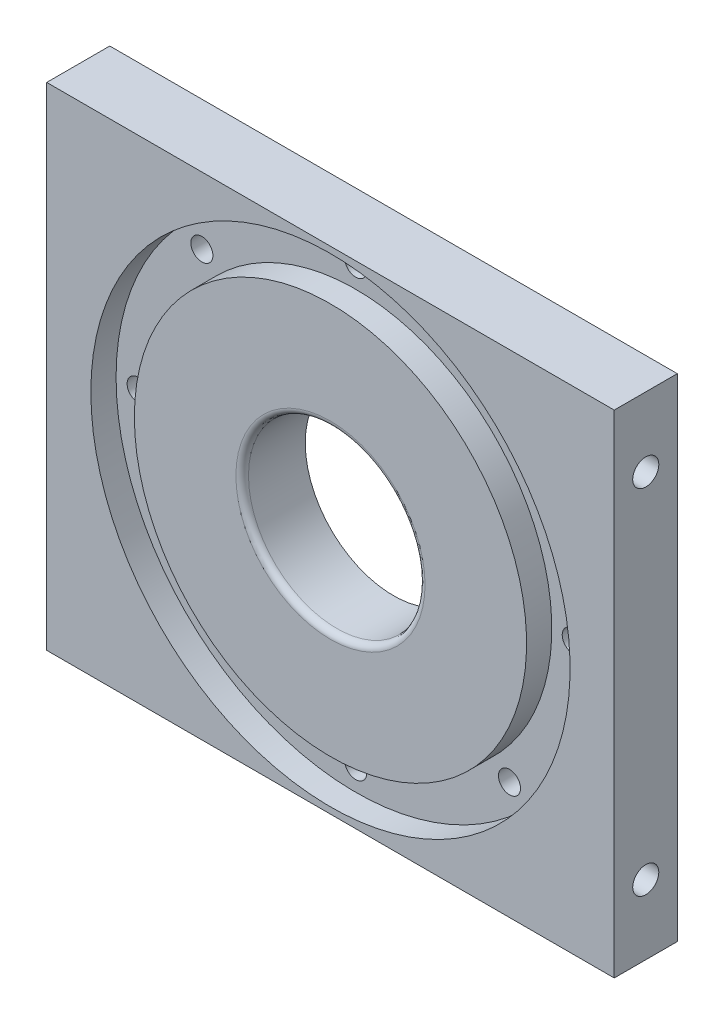
ISO-10303-21;
HEADER;
FILE_DESCRIPTION(('STEP AP214'),'2;1');
FILE_NAME('part.step','',(''),(''),'','','');
FILE_SCHEMA(('AUTOMOTIVE_DESIGN { 1 0 10303 214 1 1 1 1 }'));
ENDSEC;
DATA;
#1=APPLICATION_CONTEXT('core data for automotive mechanical design processes');
#2=APPLICATION_PROTOCOL_DEFINITION('international standard','automotive_design',2000,#1);
#3=PRODUCT_CONTEXT('',#1,'mechanical');
#4=PRODUCT('Part','Part','',(#3));
#5=PRODUCT_RELATED_PRODUCT_CATEGORY('part','',(#4));
#6=PRODUCT_DEFINITION_FORMATION('','',#4);
#7=PRODUCT_DEFINITION_CONTEXT('part definition',#1,'design');
#8=PRODUCT_DEFINITION('design','',#6,#7);
#9=PRODUCT_DEFINITION_SHAPE('','',#8);
#10=(LENGTH_UNIT() NAMED_UNIT(*) SI_UNIT(.MILLI.,.METRE.));
#11=(NAMED_UNIT(*) PLANE_ANGLE_UNIT() SI_UNIT($,.RADIAN.));
#12=(NAMED_UNIT(*) SI_UNIT($,.STERADIAN.) SOLID_ANGLE_UNIT());
#13=UNCERTAINTY_MEASURE_WITH_UNIT(LENGTH_MEASURE(1.E-05),#10,'distance_accuracy_value','');
#14=(GEOMETRIC_REPRESENTATION_CONTEXT(3) GLOBAL_UNCERTAINTY_ASSIGNED_CONTEXT((#13)) GLOBAL_UNIT_ASSIGNED_CONTEXT((#10,
#11,#12)) REPRESENTATION_CONTEXT('',''));
#15=CARTESIAN_POINT('',(0.,0.,0.));
#16=DIRECTION('',(0.,0.,1.));
#17=DIRECTION('',(1.,0.,0.));
#18=AXIS2_PLACEMENT_3D('',#15,#16,#17);
#19=CARTESIAN_POINT('',(0.,0.,6.));
#20=DIRECTION('',(0.,0.,-1.));
#21=DIRECTION('',(-1.,0.,0.));
#22=AXIS2_PLACEMENT_3D('',#19,#20,#21);
#23=PLANE('',#22);
#24=CARTESIAN_POINT('',(0.,0.,6.));
#25=DIRECTION('',(0.,0.,-1.));
#26=DIRECTION('',(-1.,0.,0.));
#27=AXIS2_PLACEMENT_3D('',#24,#25,#26);
#28=CIRCLE('',#27,31.1);
#29=CARTESIAN_POINT('',(-31.1,0.,6.));
#30=VERTEX_POINT('',#29);
#31=EDGE_CURVE('E20',#30,#30,#28,.F.);
#32=ORIENTED_EDGE('',*,*,#31,.F.);
#33=EDGE_LOOP('',(#32));
#34=FACE_BOUND('',#33,.T.);
#35=CARTESIAN_POINT('',(34.5,0.,5.99999999999999));
#36=DIRECTION('',(0.,0.,-1.));
#37=DIRECTION('',(-1.,0.,0.));
#38=AXIS2_PLACEMENT_3D('',#35,#36,#37);
#39=CIRCLE('',#38,1.75);
#40=CARTESIAN_POINT('',(32.75,0.,5.99999999999999));
#41=VERTEX_POINT('',#40);
#42=EDGE_CURVE('E93',#41,#41,#39,.T.);
#43=ORIENTED_EDGE('',*,*,#42,.T.);
#44=EDGE_LOOP('',(#43));
#45=FACE_BOUND('',#44,.T.);
#46=CARTESIAN_POINT('',(24.3951839509359,-24.3951839509359,5.99999999999999));
#47=DIRECTION('',(0.,0.,-1.));
#48=DIRECTION('',(-1.,0.,0.));
#49=AXIS2_PLACEMENT_3D('',#46,#47,#48);
#50=CIRCLE('',#49,1.75);
#51=CARTESIAN_POINT('',(22.6451839509359,-24.3951839509359,5.99999999999999));
#52=VERTEX_POINT('',#51);
#53=EDGE_CURVE('E328',#52,#52,#50,.T.);
#54=ORIENTED_EDGE('',*,*,#53,.T.);
#55=EDGE_LOOP('',(#54));
#56=FACE_BOUND('',#55,.T.);
#57=CARTESIAN_POINT('',(0.,-34.5,5.99999999999999));
#58=DIRECTION('',(0.,0.,-1.));
#59=DIRECTION('',(-1.,0.,0.));
#60=AXIS2_PLACEMENT_3D('',#57,#58,#59);
#61=CIRCLE('',#60,1.75);
#62=CARTESIAN_POINT('',(-1.75,-34.5,5.99999999999999));
#63=VERTEX_POINT('',#62);
#64=EDGE_CURVE('E331',#63,#63,#61,.T.);
#65=ORIENTED_EDGE('',*,*,#64,.T.);
#66=EDGE_LOOP('',(#65));
#67=FACE_BOUND('',#66,.T.);
#68=CARTESIAN_POINT('',(-24.3951839509359,-24.3951839509359,5.99999999999999));
#69=DIRECTION('',(0.,0.,-1.));
#70=DIRECTION('',(-1.,0.,0.));
#71=AXIS2_PLACEMENT_3D('',#68,#69,#70);
#72=CIRCLE('',#71,1.75);
#73=CARTESIAN_POINT('',(-26.1451839509359,-24.3951839509359,5.99999999999999));
#74=VERTEX_POINT('',#73);
#75=EDGE_CURVE('E334',#74,#74,#72,.T.);
#76=ORIENTED_EDGE('',*,*,#75,.T.);
#77=EDGE_LOOP('',(#76));
#78=FACE_BOUND('',#77,.T.);
#79=CARTESIAN_POINT('',(-34.5,0.,5.99999999999999));
#80=DIRECTION('',(0.,0.,-1.));
#81=DIRECTION('',(-1.,0.,0.));
#82=AXIS2_PLACEMENT_3D('',#79,#80,#81);
#83=CIRCLE('',#82,1.75);
#84=CARTESIAN_POINT('',(-36.25,0.,5.99999999999999));
#85=VERTEX_POINT('',#84);
#86=EDGE_CURVE('E337',#85,#85,#83,.T.);
#87=ORIENTED_EDGE('',*,*,#86,.T.);
#88=EDGE_LOOP('',(#87));
#89=FACE_BOUND('',#88,.T.);
#90=CARTESIAN_POINT('',(-24.3951839509359,24.3951839509359,5.99999999999999));
#91=DIRECTION('',(0.,0.,-1.));
#92=DIRECTION('',(-1.,0.,0.));
#93=AXIS2_PLACEMENT_3D('',#90,#91,#92);
#94=CIRCLE('',#93,1.75);
#95=CARTESIAN_POINT('',(-26.1451839509359,24.3951839509359,5.99999999999999));
#96=VERTEX_POINT('',#95);
#97=EDGE_CURVE('E340',#96,#96,#94,.T.);
#98=ORIENTED_EDGE('',*,*,#97,.T.);
#99=EDGE_LOOP('',(#98));
#100=FACE_BOUND('',#99,.T.);
#101=CARTESIAN_POINT('',(0.,34.5,5.99999999999999));
#102=DIRECTION('',(0.,0.,-1.));
#103=DIRECTION('',(-1.,0.,0.));
#104=AXIS2_PLACEMENT_3D('',#101,#102,#103);
#105=CIRCLE('',#104,1.75);
#106=CARTESIAN_POINT('',(-1.75000000000001,34.5,5.99999999999999));
#107=VERTEX_POINT('',#106);
#108=EDGE_CURVE('E343',#107,#107,#105,.T.);
#109=ORIENTED_EDGE('',*,*,#108,.T.);
#110=EDGE_LOOP('',(#109));
#111=FACE_BOUND('',#110,.T.);
#112=CARTESIAN_POINT('',(24.3951839509359,24.3951839509359,5.99999999999999));
#113=DIRECTION('',(0.,0.,-1.));
#114=DIRECTION('',(-1.,0.,0.));
#115=AXIS2_PLACEMENT_3D('',#112,#113,#114);
#116=CIRCLE('',#115,1.75);
#117=CARTESIAN_POINT('',(22.6451839509359,24.3951839509359,5.99999999999999));
#118=VERTEX_POINT('',#117);
#119=EDGE_CURVE('E346',#118,#118,#116,.T.);
#120=ORIENTED_EDGE('',*,*,#119,.T.);
#121=EDGE_LOOP('',(#120));
#122=FACE_BOUND('',#121,.T.);
#123=CARTESIAN_POINT('',(0.,0.,6.));
#124=DIRECTION('',(0.,0.,-1.));
#125=DIRECTION('',(-1.,0.,0.));
#126=AXIS2_PLACEMENT_3D('',#123,#124,#125);
#127=CIRCLE('',#126,38.);
#128=CARTESIAN_POINT('',(-38.,0.,6.));
#129=VERTEX_POINT('',#128);
#130=EDGE_CURVE('E349',#129,#129,#127,.F.);
#131=ORIENTED_EDGE('',*,*,#130,.T.);
#132=EDGE_LOOP('',(#131));
#133=FACE_BOUND('',#132,.T.);
#134=ADVANCED_FACE('F17',(#34,#45,#56,#67,#78,#89,#100,#111,#122,#133),#23,.F.);
#135=CARTESIAN_POINT('',(0.,0.,10.));
#136=DIRECTION('',(0.,0.,-1.));
#137=DIRECTION('',(-1.,0.,0.));
#138=AXIS2_PLACEMENT_3D('',#135,#136,#137);
#139=CYLINDRICAL_SURFACE('',#138,31.1);
#140=CARTESIAN_POINT('',(0.,0.,10.));
#141=DIRECTION('',(0.,0.,-1.));
#142=DIRECTION('',(-1.,0.,0.));
#143=AXIS2_PLACEMENT_3D('',#140,#141,#142);
#144=CIRCLE('',#143,31.1);
#145=CARTESIAN_POINT('',(-31.1,0.,10.));
#146=VERTEX_POINT('',#145);
#147=EDGE_CURVE('E86',#146,#146,#144,.F.);
#148=ORIENTED_EDGE('',*,*,#147,.F.);
#149=EDGE_LOOP('',(#148));
#150=FACE_BOUND('',#149,.T.);
#151=ORIENTED_EDGE('',*,*,#31,.T.);
#152=EDGE_LOOP('',(#151));
#153=FACE_BOUND('',#152,.T.);
#154=ADVANCED_FACE('F79',(#150,#153),#139,.T.);
#155=CARTESIAN_POINT('',(-30.0000000011664,-28.,5.));
#156=DIRECTION('',(-1.,0.,0.));
#157=DIRECTION('',(0.,0.,1.));
#158=AXIS2_PLACEMENT_3D('',#155,#156,#157);
#159=CONICAL_SURFACE('',#158,2.06699999909688,1.0297442573991);
#160=CARTESIAN_POINT('',(-28.7580210987812,-28.,4.99999999988177));
#161=VERTEX_POINT('',#160);
#162=VERTEX_LOOP('',#161);
#163=FACE_BOUND('',#162,.T.);
#164=CARTESIAN_POINT('',(-30.,-28.,5.));
#165=DIRECTION('',(-1.,0.,0.));
#166=DIRECTION('',(0.,-1.,0.));
#167=AXIS2_PLACEMENT_3D('',#164,#165,#166);
#168=CIRCLE('',#167,2.067);
#169=CARTESIAN_POINT('',(-30.,-30.067,5.));
#170=VERTEX_POINT('',#169);
#171=EDGE_CURVE('E83',#170,#170,#168,.T.);
#172=ORIENTED_EDGE('',*,*,#171,.T.);
#173=EDGE_LOOP('',(#172));
#174=FACE_BOUND('',#173,.T.);
#175=ADVANCED_FACE('F75',(#163,#174),#159,.F.);
#176=CARTESIAN_POINT('',(-30.0000000011664,28.,5.));
#177=DIRECTION('',(-1.,0.,0.));
#178=DIRECTION('',(0.,0.,1.));
#179=AXIS2_PLACEMENT_3D('',#176,#177,#178);
#180=CONICAL_SURFACE('',#179,2.06699999909688,1.0297442573991);
#181=CARTESIAN_POINT('',(-28.7580210987812,28.,4.99999999988177));
#182=VERTEX_POINT('',#181);
#183=VERTEX_LOOP('',#182);
#184=FACE_BOUND('',#183,.T.);
#185=CARTESIAN_POINT('',(-30.,28.,5.));
#186=DIRECTION('',(-1.,0.,0.));
#187=DIRECTION('',(0.,-1.,0.));
#188=AXIS2_PLACEMENT_3D('',#185,#186,#187);
#189=CIRCLE('',#188,2.067);
#190=CARTESIAN_POINT('',(-30.,25.933,5.));
#191=VERTEX_POINT('',#190);
#192=EDGE_CURVE('E85',#191,#191,#189,.T.);
#193=ORIENTED_EDGE('',*,*,#192,.T.);
#194=EDGE_LOOP('',(#193));
#195=FACE_BOUND('',#194,.T.);
#196=ADVANCED_FACE('F78',(#184,#195),#180,.F.);
#197=CARTESIAN_POINT('',(30.0000000011664,-28.,5.));
#198=DIRECTION('',(1.,0.,0.));
#199=DIRECTION('',(0.,0.,-1.));
#200=AXIS2_PLACEMENT_3D('',#197,#198,#199);
#201=CONICAL_SURFACE('',#200,2.06699999910597,1.02974425739085);
#202=CARTESIAN_POINT('',(28.7580210987812,-28.,5.00000000016598));
#203=VERTEX_POINT('',#202);
#204=VERTEX_LOOP('',#203);
#205=FACE_BOUND('',#204,.T.);
#206=CARTESIAN_POINT('',(30.,-28.,5.));
#207=DIRECTION('',(1.,0.,0.));
#208=DIRECTION('',(0.,0.,-1.));
#209=AXIS2_PLACEMENT_3D('',#206,#207,#208);
#210=CIRCLE('',#209,2.067);
#211=CARTESIAN_POINT('',(30.,-28.,2.933));
#212=VERTEX_POINT('',#211);
#213=EDGE_CURVE('E89',#212,#212,#210,.T.);
#214=ORIENTED_EDGE('',*,*,#213,.T.);
#215=EDGE_LOOP('',(#214));
#216=FACE_BOUND('',#215,.T.);
#217=ADVANCED_FACE('F161',(#205,#216),#201,.F.);
#218=CARTESIAN_POINT('',(30.0000000011664,28.,5.));
#219=DIRECTION('',(1.,0.,0.));
#220=DIRECTION('',(0.,0.,-1.));
#221=AXIS2_PLACEMENT_3D('',#218,#219,#220);
#222=CONICAL_SURFACE('',#221,2.06699999910597,1.02974425739085);
#223=CARTESIAN_POINT('',(28.7580210987812,28.,5.00000000016598));
#224=VERTEX_POINT('',#223);
#225=VERTEX_LOOP('',#224);
#226=FACE_BOUND('',#225,.T.);
#227=CARTESIAN_POINT('',(30.,28.,5.));
#228=DIRECTION('',(1.,0.,0.));
#229=DIRECTION('',(0.,0.,-1.));
#230=AXIS2_PLACEMENT_3D('',#227,#228,#229);
#231=CIRCLE('',#230,2.067);
#232=CARTESIAN_POINT('',(30.,28.,2.933));
#233=VERTEX_POINT('',#232);
#234=EDGE_CURVE('E249',#233,#233,#231,.T.);
#235=ORIENTED_EDGE('',*,*,#234,.T.);
#236=EDGE_LOOP('',(#235));
#237=FACE_BOUND('',#236,.T.);
#238=ADVANCED_FACE('F157',(#226,#237),#222,.F.);
#239=CARTESIAN_POINT('',(0.,0.,10.));
#240=DIRECTION('',(0.,0.,-1.));
#241=DIRECTION('',(-1.,0.,0.));
#242=AXIS2_PLACEMENT_3D('',#239,#240,#241);
#243=CYLINDRICAL_SURFACE('',#242,38.);
#244=CARTESIAN_POINT('',(0.,0.,10.));
#245=DIRECTION('',(0.,0.,-1.));
#246=DIRECTION('',(-1.,0.,0.));
#247=AXIS2_PLACEMENT_3D('',#244,#245,#246);
#248=CIRCLE('',#247,38.);
#249=CARTESIAN_POINT('',(-38.,0.,10.));
#250=VERTEX_POINT('',#249);
#251=EDGE_CURVE('E253',#250,#250,#248,.T.);
#252=ORIENTED_EDGE('',*,*,#251,.F.);
#253=EDGE_LOOP('',(#252));
#254=FACE_BOUND('',#253,.T.);
#255=ORIENTED_EDGE('',*,*,#130,.F.);
#256=EDGE_LOOP('',(#255));
#257=FACE_BOUND('',#256,.T.);
#258=ADVANCED_FACE('F153',(#254,#257),#243,.F.);
#259=CARTESIAN_POINT('',(24.3951839509359,24.3951839509359,119.515689346629));
#260=DIRECTION('',(0.,0.,-1.));
#261=DIRECTION('',(-1.,0.,0.));
#262=AXIS2_PLACEMENT_3D('',#259,#260,#261);
#263=CYLINDRICAL_SURFACE('',#262,1.75);
#264=CARTESIAN_POINT('',(24.3951839509359,24.3951839509359,3.));
#265=DIRECTION('',(0.,0.,-1.));
#266=DIRECTION('',(-1.,0.,0.));
#267=AXIS2_PLACEMENT_3D('',#264,#265,#266);
#268=CIRCLE('',#267,1.75);
#269=CARTESIAN_POINT('',(22.6451839509359,24.3951839509359,3.));
#270=VERTEX_POINT('',#269);
#271=EDGE_CURVE('E318',#270,#270,#268,.F.);
#272=ORIENTED_EDGE('',*,*,#271,.F.);
#273=EDGE_LOOP('',(#272));
#274=FACE_BOUND('',#273,.T.);
#275=ORIENTED_EDGE('',*,*,#119,.F.);
#276=EDGE_LOOP('',(#275));
#277=FACE_BOUND('',#276,.T.);
#278=ADVANCED_FACE('F149',(#274,#277),#263,.F.);
#279=CARTESIAN_POINT('',(0.,34.5,119.515689346629));
#280=DIRECTION('',(0.,0.,-1.));
#281=DIRECTION('',(-1.,0.,0.));
#282=AXIS2_PLACEMENT_3D('',#279,#280,#281);
#283=CYLINDRICAL_SURFACE('',#282,1.75);
#284=CARTESIAN_POINT('',(0.,34.5,3.));
#285=DIRECTION('',(0.,0.,-1.));
#286=DIRECTION('',(-1.,0.,0.));
#287=AXIS2_PLACEMENT_3D('',#284,#285,#286);
#288=CIRCLE('',#287,1.75);
#289=CARTESIAN_POINT('',(-1.75000000000001,34.5,3.));
#290=VERTEX_POINT('',#289);
#291=EDGE_CURVE('E315',#290,#290,#288,.F.);
#292=ORIENTED_EDGE('',*,*,#291,.F.);
#293=EDGE_LOOP('',(#292));
#294=FACE_BOUND('',#293,.T.);
#295=ORIENTED_EDGE('',*,*,#108,.F.);
#296=EDGE_LOOP('',(#295));
#297=FACE_BOUND('',#296,.T.);
#298=ADVANCED_FACE('F145',(#294,#297),#283,.F.);
#299=CARTESIAN_POINT('',(-24.3951839509359,24.3951839509359,119.515689346629));
#300=DIRECTION('',(0.,0.,-1.));
#301=DIRECTION('',(-1.,0.,0.));
#302=AXIS2_PLACEMENT_3D('',#299,#300,#301);
#303=CYLINDRICAL_SURFACE('',#302,1.75);
#304=CARTESIAN_POINT('',(-24.3951839509359,24.3951839509359,3.));
#305=DIRECTION('',(0.,0.,-1.));
#306=DIRECTION('',(-1.,0.,0.));
#307=AXIS2_PLACEMENT_3D('',#304,#305,#306);
#308=CIRCLE('',#307,1.75);
#309=CARTESIAN_POINT('',(-26.1451839509359,24.3951839509359,3.));
#310=VERTEX_POINT('',#309);
#311=EDGE_CURVE('E312',#310,#310,#308,.F.);
#312=ORIENTED_EDGE('',*,*,#311,.F.);
#313=EDGE_LOOP('',(#312));
#314=FACE_BOUND('',#313,.T.);
#315=ORIENTED_EDGE('',*,*,#97,.F.);
#316=EDGE_LOOP('',(#315));
#317=FACE_BOUND('',#316,.T.);
#318=ADVANCED_FACE('F141',(#314,#317),#303,.F.);
#319=CARTESIAN_POINT('',(-34.5,0.,119.515689346629));
#320=DIRECTION('',(0.,0.,-1.));
#321=DIRECTION('',(-1.,0.,0.));
#322=AXIS2_PLACEMENT_3D('',#319,#320,#321);
#323=CYLINDRICAL_SURFACE('',#322,1.75);
#324=CARTESIAN_POINT('',(-34.5,0.,3.));
#325=DIRECTION('',(0.,0.,-1.));
#326=DIRECTION('',(-1.,0.,0.));
#327=AXIS2_PLACEMENT_3D('',#324,#325,#326);
#328=CIRCLE('',#327,1.75);
#329=CARTESIAN_POINT('',(-36.25,0.,3.));
#330=VERTEX_POINT('',#329);
#331=EDGE_CURVE('E309',#330,#330,#328,.F.);
#332=ORIENTED_EDGE('',*,*,#331,.F.);
#333=EDGE_LOOP('',(#332));
#334=FACE_BOUND('',#333,.T.);
#335=ORIENTED_EDGE('',*,*,#86,.F.);
#336=EDGE_LOOP('',(#335));
#337=FACE_BOUND('',#336,.T.);
#338=ADVANCED_FACE('F137',(#334,#337),#323,.F.);
#339=CARTESIAN_POINT('',(-24.3951839509359,-24.3951839509359,119.515689346629));
#340=DIRECTION('',(0.,0.,-1.));
#341=DIRECTION('',(-1.,0.,0.));
#342=AXIS2_PLACEMENT_3D('',#339,#340,#341);
#343=CYLINDRICAL_SURFACE('',#342,1.75);
#344=CARTESIAN_POINT('',(-24.3951839509359,-24.3951839509359,3.));
#345=DIRECTION('',(0.,0.,-1.));
#346=DIRECTION('',(-1.,0.,0.));
#347=AXIS2_PLACEMENT_3D('',#344,#345,#346);
#348=CIRCLE('',#347,1.75);
#349=CARTESIAN_POINT('',(-26.1451839509359,-24.3951839509359,3.));
#350=VERTEX_POINT('',#349);
#351=EDGE_CURVE('E306',#350,#350,#348,.F.);
#352=ORIENTED_EDGE('',*,*,#351,.F.);
#353=EDGE_LOOP('',(#352));
#354=FACE_BOUND('',#353,.T.);
#355=ORIENTED_EDGE('',*,*,#75,.F.);
#356=EDGE_LOOP('',(#355));
#357=FACE_BOUND('',#356,.T.);
#358=ADVANCED_FACE('F133',(#354,#357),#343,.F.);
#359=CARTESIAN_POINT('',(0.,-34.5,119.515689346629));
#360=DIRECTION('',(0.,0.,-1.));
#361=DIRECTION('',(-1.,0.,0.));
#362=AXIS2_PLACEMENT_3D('',#359,#360,#361);
#363=CYLINDRICAL_SURFACE('',#362,1.75);
#364=CARTESIAN_POINT('',(0.,-34.5,3.));
#365=DIRECTION('',(0.,0.,-1.));
#366=DIRECTION('',(-1.,0.,0.));
#367=AXIS2_PLACEMENT_3D('',#364,#365,#366);
#368=CIRCLE('',#367,1.75);
#369=CARTESIAN_POINT('',(-1.75,-34.5,3.));
#370=VERTEX_POINT('',#369);
#371=EDGE_CURVE('E303',#370,#370,#368,.F.);
#372=ORIENTED_EDGE('',*,*,#371,.F.);
#373=EDGE_LOOP('',(#372));
#374=FACE_BOUND('',#373,.T.);
#375=ORIENTED_EDGE('',*,*,#64,.F.);
#376=EDGE_LOOP('',(#375));
#377=FACE_BOUND('',#376,.T.);
#378=ADVANCED_FACE('F129',(#374,#377),#363,.F.);
#379=CARTESIAN_POINT('',(24.3951839509359,-24.3951839509359,119.515689346629));
#380=DIRECTION('',(0.,0.,-1.));
#381=DIRECTION('',(-1.,0.,0.));
#382=AXIS2_PLACEMENT_3D('',#379,#380,#381);
#383=CYLINDRICAL_SURFACE('',#382,1.75);
#384=CARTESIAN_POINT('',(24.3951839509359,-24.3951839509359,3.));
#385=DIRECTION('',(0.,0.,-1.));
#386=DIRECTION('',(-1.,0.,0.));
#387=AXIS2_PLACEMENT_3D('',#384,#385,#386);
#388=CIRCLE('',#387,1.75);
#389=CARTESIAN_POINT('',(22.6451839509359,-24.3951839509359,3.));
#390=VERTEX_POINT('',#389);
#391=EDGE_CURVE('E299',#390,#390,#388,.F.);
#392=ORIENTED_EDGE('',*,*,#391,.F.);
#393=EDGE_LOOP('',(#392));
#394=FACE_BOUND('',#393,.T.);
#395=ORIENTED_EDGE('',*,*,#53,.F.);
#396=EDGE_LOOP('',(#395));
#397=FACE_BOUND('',#396,.T.);
#398=ADVANCED_FACE('F125',(#394,#397),#383,.F.);
#399=CARTESIAN_POINT('',(34.5,0.,119.515689346629));
#400=DIRECTION('',(0.,0.,-1.));
#401=DIRECTION('',(-1.,0.,0.));
#402=AXIS2_PLACEMENT_3D('',#399,#400,#401);
#403=CYLINDRICAL_SURFACE('',#402,1.75);
#404=CARTESIAN_POINT('',(34.5,0.,3.));
#405=DIRECTION('',(0.,0.,-1.));
#406=DIRECTION('',(-1.,0.,0.));
#407=AXIS2_PLACEMENT_3D('',#404,#405,#406);
#408=CIRCLE('',#407,1.75);
#409=CARTESIAN_POINT('',(32.75,0.,3.));
#410=VERTEX_POINT('',#409);
#411=EDGE_CURVE('E295',#410,#410,#408,.F.);
#412=ORIENTED_EDGE('',*,*,#411,.F.);
#413=EDGE_LOOP('',(#412));
#414=FACE_BOUND('',#413,.T.);
#415=ORIENTED_EDGE('',*,*,#42,.F.);
#416=EDGE_LOOP('',(#415));
#417=FACE_BOUND('',#416,.T.);
#418=ADVANCED_FACE('F121',(#414,#417),#403,.F.);
#419=CARTESIAN_POINT('',(0.,0.,10.));
#420=DIRECTION('',(0.,0.,1.));
#421=DIRECTION('',(1.,0.,0.));
#422=AXIS2_PLACEMENT_3D('',#419,#420,#421);
#423=PLANE('',#422);
#424=CARTESIAN_POINT('',(0.,0.,10.));
#425=DIRECTION('',(0.,0.,1.));
#426=DIRECTION('',(1.,0.,0.));
#427=AXIS2_PLACEMENT_3D('',#424,#425,#426);
#428=CIRCLE('',#427,15.);
#429=CARTESIAN_POINT('',(15.,0.,10.));
#430=VERTEX_POINT('',#429);
#431=EDGE_CURVE('E104',#430,#430,#428,.T.);
#432=ORIENTED_EDGE('',*,*,#431,.F.);
#433=EDGE_LOOP('',(#432));
#434=FACE_BOUND('',#433,.T.);
#435=ORIENTED_EDGE('',*,*,#147,.T.);
#436=EDGE_LOOP('',(#435));
#437=FACE_BOUND('',#436,.T.);
#438=ADVANCED_FACE('F110',(#434,#437),#423,.T.);
#439=CARTESIAN_POINT('',(-37.5,-28.,5.));
#440=DIRECTION('',(-1.,0.,0.));
#441=DIRECTION('',(0.,-1.,0.));
#442=AXIS2_PLACEMENT_3D('',#439,#440,#441);
#443=CYLINDRICAL_SURFACE('',#442,2.067);
#444=ORIENTED_EDGE('',*,*,#171,.F.);
#445=EDGE_LOOP('',(#444));
#446=FACE_BOUND('',#445,.T.);
#447=CARTESIAN_POINT('',(-45.,-28.,5.));
#448=DIRECTION('',(-1.,0.,0.));
#449=DIRECTION('',(0.,-1.,0.));
#450=AXIS2_PLACEMENT_3D('',#447,#448,#449);
#451=CIRCLE('',#450,2.067);
#452=CARTESIAN_POINT('',(-45.,-30.067,5.));
#453=VERTEX_POINT('',#452);
#454=EDGE_CURVE('E292',#453,#453,#451,.F.);
#455=ORIENTED_EDGE('',*,*,#454,.F.);
#456=EDGE_LOOP('',(#455));
#457=FACE_BOUND('',#456,.T.);
#458=ADVANCED_FACE('F120',(#446,#457),#443,.F.);
#459=CARTESIAN_POINT('',(-37.5,28.,5.));
#460=DIRECTION('',(-1.,0.,0.));
#461=DIRECTION('',(0.,-1.,0.));
#462=AXIS2_PLACEMENT_3D('',#459,#460,#461);
#463=CYLINDRICAL_SURFACE('',#462,2.067);
#464=ORIENTED_EDGE('',*,*,#192,.F.);
#465=EDGE_LOOP('',(#464));
#466=FACE_BOUND('',#465,.T.);
#467=CARTESIAN_POINT('',(-45.,28.,5.));
#468=DIRECTION('',(-1.,0.,0.));
#469=DIRECTION('',(0.,-1.,0.));
#470=AXIS2_PLACEMENT_3D('',#467,#468,#469);
#471=CIRCLE('',#470,2.067);
#472=CARTESIAN_POINT('',(-45.,25.933,5.));
#473=VERTEX_POINT('',#472);
#474=EDGE_CURVE('E288',#473,#473,#471,.F.);
#475=ORIENTED_EDGE('',*,*,#474,.F.);
#476=EDGE_LOOP('',(#475));
#477=FACE_BOUND('',#476,.T.);
#478=ADVANCED_FACE('F270',(#466,#477),#463,.F.);
#479=CARTESIAN_POINT('',(37.5,-28.,5.));
#480=DIRECTION('',(1.,0.,0.));
#481=DIRECTION('',(0.,0.,-1.));
#482=AXIS2_PLACEMENT_3D('',#479,#480,#481);
#483=CYLINDRICAL_SURFACE('',#482,2.067);
#484=ORIENTED_EDGE('',*,*,#213,.F.);
#485=EDGE_LOOP('',(#484));
#486=FACE_BOUND('',#485,.T.);
#487=CARTESIAN_POINT('',(45.,-28.,5.));
#488=DIRECTION('',(1.,0.,0.));
#489=DIRECTION('',(0.,0.,-1.));
#490=AXIS2_PLACEMENT_3D('',#487,#488,#489);
#491=CIRCLE('',#490,2.067);
#492=CARTESIAN_POINT('',(45.,-28.,2.933));
#493=VERTEX_POINT('',#492);
#494=EDGE_CURVE('E274',#493,#493,#491,.F.);
#495=ORIENTED_EDGE('',*,*,#494,.F.);
#496=EDGE_LOOP('',(#495));
#497=FACE_BOUND('',#496,.T.);
#498=ADVANCED_FACE('F266',(#486,#497),#483,.F.);
#499=CARTESIAN_POINT('',(37.5,28.,5.));
#500=DIRECTION('',(1.,0.,0.));
#501=DIRECTION('',(0.,0.,-1.));
#502=AXIS2_PLACEMENT_3D('',#499,#500,#501);
#503=CYLINDRICAL_SURFACE('',#502,2.067);
#504=ORIENTED_EDGE('',*,*,#234,.F.);
#505=EDGE_LOOP('',(#504));
#506=FACE_BOUND('',#505,.T.);
#507=CARTESIAN_POINT('',(45.,28.,5.));
#508=DIRECTION('',(1.,0.,0.));
#509=DIRECTION('',(0.,0.,-1.));
#510=AXIS2_PLACEMENT_3D('',#507,#508,#509);
#511=CIRCLE('',#510,2.067);
#512=CARTESIAN_POINT('',(45.,28.,2.933));
#513=VERTEX_POINT('',#512);
#514=EDGE_CURVE('E276',#513,#513,#511,.F.);
#515=ORIENTED_EDGE('',*,*,#514,.F.);
#516=EDGE_LOOP('',(#515));
#517=FACE_BOUND('',#516,.T.);
#518=ADVANCED_FACE('F269',(#506,#517),#503,.F.);
#519=CARTESIAN_POINT('',(0.,0.,10.));
#520=DIRECTION('',(0.,0.,1.));
#521=DIRECTION('',(1.,0.,0.));
#522=AXIS2_PLACEMENT_3D('',#519,#520,#521);
#523=PLANE('',#522);
#524=ORIENTED_EDGE('',*,*,#251,.T.);
#525=EDGE_LOOP('',(#524));
#526=FACE_BOUND('',#525,.T.);
#527=DIRECTION('',(0.,1.,0.));
#528=VECTOR('',#527,1.);
#529=CARTESIAN_POINT('',(-45.,-39.,10.));
#530=LINE('',#529,#528);
#531=CARTESIAN_POINT('',(-45.,-39.,10.));
#532=VERTEX_POINT('',#531);
#533=CARTESIAN_POINT('',(-45.,39.,10.));
#534=VERTEX_POINT('',#533);
#535=EDGE_CURVE('E247',#532,#534,#530,.T.);
#536=ORIENTED_EDGE('',*,*,#535,.F.);
#537=DIRECTION('',(1.,0.,0.));
#538=VECTOR('',#537,1.);
#539=CARTESIAN_POINT('',(45.,-39.,10.));
#540=LINE('',#539,#538);
#541=CARTESIAN_POINT('',(45.,-39.,10.));
#542=VERTEX_POINT('',#541);
#543=EDGE_CURVE('E291',#542,#532,#540,.F.);
#544=ORIENTED_EDGE('',*,*,#543,.F.);
#545=DIRECTION('',(0.,1.,0.));
#546=VECTOR('',#545,1.);
#547=CARTESIAN_POINT('',(45.,39.,10.));
#548=LINE('',#547,#546);
#549=CARTESIAN_POINT('',(45.,39.,10.));
#550=VERTEX_POINT('',#549);
#551=EDGE_CURVE('E284',#550,#542,#548,.F.);
#552=ORIENTED_EDGE('',*,*,#551,.F.);
#553=DIRECTION('',(1.,0.,0.));
#554=VECTOR('',#553,1.);
#555=CARTESIAN_POINT('',(-45.,39.,10.));
#556=LINE('',#555,#554);
#557=EDGE_CURVE('E282',#534,#550,#556,.T.);
#558=ORIENTED_EDGE('',*,*,#557,.F.);
#559=EDGE_LOOP('',(#536,#544,#552,#558));
#560=FACE_BOUND('',#559,.T.);
#561=ADVANCED_FACE('F449',(#526,#560),#523,.T.);
#562=CARTESIAN_POINT('',(24.3951839509359,24.3951839509359,3.));
#563=DIRECTION('',(0.,0.,-1.));
#564=DIRECTION('',(-1.,0.,0.));
#565=AXIS2_PLACEMENT_3D('',#562,#563,#564);
#566=PLANE('',#565);
#567=ORIENTED_EDGE('',*,*,#271,.T.);
#568=EDGE_LOOP('',(#567));
#569=FACE_BOUND('',#568,.T.);
#570=CARTESIAN_POINT('',(24.3951839509359,24.3951839509359,3.));
#571=DIRECTION('',(0.,0.,-1.));
#572=DIRECTION('',(-1.,0.,0.));
#573=AXIS2_PLACEMENT_3D('',#570,#571,#572);
#574=CIRCLE('',#573,3.);
#575=CARTESIAN_POINT('',(21.3951839509359,24.3951839509359,3.));
#576=VERTEX_POINT('',#575);
#577=EDGE_CURVE('E419',#576,#576,#574,.T.);
#578=ORIENTED_EDGE('',*,*,#577,.T.);
#579=EDGE_LOOP('',(#578));
#580=FACE_BOUND('',#579,.T.);
#581=ADVANCED_FACE('F516',(#569,#580),#566,.T.);
#582=CARTESIAN_POINT('',(0.,34.5,3.));
#583=DIRECTION('',(0.,0.,-1.));
#584=DIRECTION('',(-1.,0.,0.));
#585=AXIS2_PLACEMENT_3D('',#582,#583,#584);
#586=PLANE('',#585);
#587=ORIENTED_EDGE('',*,*,#291,.T.);
#588=EDGE_LOOP('',(#587));
#589=FACE_BOUND('',#588,.T.);
#590=CARTESIAN_POINT('',(0.,34.5,3.));
#591=DIRECTION('',(0.,0.,-1.));
#592=DIRECTION('',(-1.,0.,0.));
#593=AXIS2_PLACEMENT_3D('',#590,#591,#592);
#594=CIRCLE('',#593,3.);
#595=CARTESIAN_POINT('',(-3.00000000000001,34.5,3.));
#596=VERTEX_POINT('',#595);
#597=EDGE_CURVE('E417',#596,#596,#594,.T.);
#598=ORIENTED_EDGE('',*,*,#597,.T.);
#599=EDGE_LOOP('',(#598));
#600=FACE_BOUND('',#599,.T.);
#601=ADVANCED_FACE('F523',(#589,#600),#586,.T.);
#602=CARTESIAN_POINT('',(-24.3951839509359,24.3951839509359,3.));
#603=DIRECTION('',(0.,0.,-1.));
#604=DIRECTION('',(-1.,0.,0.));
#605=AXIS2_PLACEMENT_3D('',#602,#603,#604);
#606=PLANE('',#605);
#607=ORIENTED_EDGE('',*,*,#311,.T.);
#608=EDGE_LOOP('',(#607));
#609=FACE_BOUND('',#608,.T.);
#610=CARTESIAN_POINT('',(-24.3951839509359,24.3951839509359,3.));
#611=DIRECTION('',(0.,0.,-1.));
#612=DIRECTION('',(-1.,0.,0.));
#613=AXIS2_PLACEMENT_3D('',#610,#611,#612);
#614=CIRCLE('',#613,3.);
#615=CARTESIAN_POINT('',(-27.3951839509359,24.3951839509359,3.));
#616=VERTEX_POINT('',#615);
#617=EDGE_CURVE('E414',#616,#616,#614,.T.);
#618=ORIENTED_EDGE('',*,*,#617,.T.);
#619=EDGE_LOOP('',(#618));
#620=FACE_BOUND('',#619,.T.);
#621=ADVANCED_FACE('F677',(#609,#620),#606,.T.);
#622=CARTESIAN_POINT('',(-34.5,0.,3.));
#623=DIRECTION('',(0.,0.,-1.));
#624=DIRECTION('',(-1.,0.,0.));
#625=AXIS2_PLACEMENT_3D('',#622,#623,#624);
#626=PLANE('',#625);
#627=ORIENTED_EDGE('',*,*,#331,.T.);
#628=EDGE_LOOP('',(#627));
#629=FACE_BOUND('',#628,.T.);
#630=CARTESIAN_POINT('',(-34.5,0.,3.));
#631=DIRECTION('',(0.,0.,-1.));
#632=DIRECTION('',(-1.,0.,0.));
#633=AXIS2_PLACEMENT_3D('',#630,#631,#632);
#634=CIRCLE('',#633,3.);
#635=CARTESIAN_POINT('',(-37.5,0.,3.));
#636=VERTEX_POINT('',#635);
#637=EDGE_CURVE('E411',#636,#636,#634,.T.);
#638=ORIENTED_EDGE('',*,*,#637,.T.);
#639=EDGE_LOOP('',(#638));
#640=FACE_BOUND('',#639,.T.);
#641=ADVANCED_FACE('F685',(#629,#640),#626,.T.);
#642=CARTESIAN_POINT('',(-24.3951839509359,-24.3951839509359,3.));
#643=DIRECTION('',(0.,0.,-1.));
#644=DIRECTION('',(-1.,0.,0.));
#645=AXIS2_PLACEMENT_3D('',#642,#643,#644);
#646=PLANE('',#645);
#647=ORIENTED_EDGE('',*,*,#351,.T.);
#648=EDGE_LOOP('',(#647));
#649=FACE_BOUND('',#648,.T.);
#650=CARTESIAN_POINT('',(-24.3951839509359,-24.3951839509359,3.));
#651=DIRECTION('',(0.,0.,-1.));
#652=DIRECTION('',(-1.,0.,0.));
#653=AXIS2_PLACEMENT_3D('',#650,#651,#652);
#654=CIRCLE('',#653,3.);
#655=CARTESIAN_POINT('',(-27.3951839509359,-24.3951839509359,3.));
#656=VERTEX_POINT('',#655);
#657=EDGE_CURVE('E408',#656,#656,#654,.T.);
#658=ORIENTED_EDGE('',*,*,#657,.T.);
#659=EDGE_LOOP('',(#658));
#660=FACE_BOUND('',#659,.T.);
#661=ADVANCED_FACE('F694',(#649,#660),#646,.T.);
#662=CARTESIAN_POINT('',(0.,-34.5,3.));
#663=DIRECTION('',(0.,0.,-1.));
#664=DIRECTION('',(-1.,0.,0.));
#665=AXIS2_PLACEMENT_3D('',#662,#663,#664);
#666=PLANE('',#665);
#667=ORIENTED_EDGE('',*,*,#371,.T.);
#668=EDGE_LOOP('',(#667));
#669=FACE_BOUND('',#668,.T.);
#670=CARTESIAN_POINT('',(0.,-34.5,3.));
#671=DIRECTION('',(0.,0.,-1.));
#672=DIRECTION('',(-1.,0.,0.));
#673=AXIS2_PLACEMENT_3D('',#670,#671,#672);
#674=CIRCLE('',#673,3.);
#675=CARTESIAN_POINT('',(-3.,-34.5,3.));
#676=VERTEX_POINT('',#675);
#677=EDGE_CURVE('E400',#676,#676,#674,.T.);
#678=ORIENTED_EDGE('',*,*,#677,.T.);
#679=EDGE_LOOP('',(#678));
#680=FACE_BOUND('',#679,.T.);
#681=ADVANCED_FACE('F703',(#669,#680),#666,.T.);
#682=CARTESIAN_POINT('',(24.3951839509359,-24.3951839509359,3.));
#683=DIRECTION('',(0.,0.,-1.));
#684=DIRECTION('',(-1.,0.,0.));
#685=AXIS2_PLACEMENT_3D('',#682,#683,#684);
#686=PLANE('',#685);
#687=ORIENTED_EDGE('',*,*,#391,.T.);
#688=EDGE_LOOP('',(#687));
#689=FACE_BOUND('',#688,.T.);
#690=CARTESIAN_POINT('',(24.3951839509359,-24.3951839509359,3.));
#691=DIRECTION('',(0.,0.,-1.));
#692=DIRECTION('',(-1.,0.,0.));
#693=AXIS2_PLACEMENT_3D('',#690,#691,#692);
#694=CIRCLE('',#693,3.);
#695=CARTESIAN_POINT('',(21.3951839509359,-24.3951839509359,3.));
#696=VERTEX_POINT('',#695);
#697=EDGE_CURVE('E391',#696,#696,#694,.T.);
#698=ORIENTED_EDGE('',*,*,#697,.T.);
#699=EDGE_LOOP('',(#698));
#700=FACE_BOUND('',#699,.T.);
#701=ADVANCED_FACE('F712',(#689,#700),#686,.T.);
#702=CARTESIAN_POINT('',(34.5,0.,3.));
#703=DIRECTION('',(0.,0.,-1.));
#704=DIRECTION('',(-1.,0.,0.));
#705=AXIS2_PLACEMENT_3D('',#702,#703,#704);
#706=PLANE('',#705);
#707=ORIENTED_EDGE('',*,*,#411,.T.);
#708=EDGE_LOOP('',(#707));
#709=FACE_BOUND('',#708,.T.);
#710=CARTESIAN_POINT('',(34.5,0.,3.));
#711=DIRECTION('',(0.,0.,-1.));
#712=DIRECTION('',(-1.,0.,0.));
#713=AXIS2_PLACEMENT_3D('',#710,#711,#712);
#714=CIRCLE('',#713,3.);
#715=CARTESIAN_POINT('',(31.5,0.,3.));
#716=VERTEX_POINT('',#715);
#717=EDGE_CURVE('E388',#716,#716,#714,.T.);
#718=ORIENTED_EDGE('',*,*,#717,.T.);
#719=EDGE_LOOP('',(#718));
#720=FACE_BOUND('',#719,.T.);
#721=ADVANCED_FACE('F241',(#709,#720),#706,.T.);
#722=CARTESIAN_POINT('',(0.,0.,9.));
#723=DIRECTION('',(0.,0.,-1.));
#724=DIRECTION('',(-1.,0.,0.));
#725=AXIS2_PLACEMENT_3D('',#722,#723,#724);
#726=TOROIDAL_SURFACE('',#725,15.,1.);
#727=ORIENTED_EDGE('',*,*,#431,.T.);
#728=EDGE_LOOP('',(#727));
#729=FACE_BOUND('',#728,.T.);
#730=CARTESIAN_POINT('',(0.,0.,9.));
#731=DIRECTION('',(0.,0.,1.));
#732=DIRECTION('',(1.,0.,0.));
#733=AXIS2_PLACEMENT_3D('',#730,#731,#732);
#734=CIRCLE('',#733,14.);
#735=CARTESIAN_POINT('',(14.,0.,9.));
#736=VERTEX_POINT('',#735);
#737=EDGE_CURVE('E390',#736,#736,#734,.F.);
#738=ORIENTED_EDGE('',*,*,#737,.T.);
#739=EDGE_LOOP('',(#738));
#740=FACE_BOUND('',#739,.T.);
#741=ADVANCED_FACE('F235',(#729,#740),#726,.T.);
#742=CARTESIAN_POINT('',(-45.,-39.,0.));
#743=DIRECTION('',(-1.,0.,0.));
#744=DIRECTION('',(0.,0.,1.));
#745=AXIS2_PLACEMENT_3D('',#742,#743,#744);
#746=PLANE('',#745);
#747=ORIENTED_EDGE('',*,*,#474,.T.);
#748=EDGE_LOOP('',(#747));
#749=FACE_BOUND('',#748,.T.);
#750=ORIENTED_EDGE('',*,*,#454,.T.);
#751=EDGE_LOOP('',(#750));
#752=FACE_BOUND('',#751,.T.);
#753=DIRECTION('',(0.,1.,0.));
#754=VECTOR('',#753,1.);
#755=CARTESIAN_POINT('',(-45.,0.,0.));
#756=LINE('',#755,#754);
#757=CARTESIAN_POINT('',(-45.,39.,0.));
#758=VERTEX_POINT('',#757);
#759=CARTESIAN_POINT('',(-45.,-39.,0.));
#760=VERTEX_POINT('',#759);
#761=EDGE_CURVE('E396',#758,#760,#756,.F.);
#762=ORIENTED_EDGE('',*,*,#761,.T.);
#763=DIRECTION('',(0.,0.,-1.));
#764=VECTOR('',#763,1.);
#765=CARTESIAN_POINT('',(-45.,-39.,0.));
#766=LINE('',#765,#764);
#767=EDGE_CURVE('E439',#532,#760,#766,.T.);
#768=ORIENTED_EDGE('',*,*,#767,.F.);
#769=ORIENTED_EDGE('',*,*,#535,.T.);
#770=DIRECTION('',(0.,0.,1.));
#771=VECTOR('',#770,1.);
#772=CARTESIAN_POINT('',(-45.,39.,0.));
#773=LINE('',#772,#771);
#774=EDGE_CURVE('E422',#758,#534,#773,.T.);
#775=ORIENTED_EDGE('',*,*,#774,.F.);
#776=EDGE_LOOP('',(#762,#768,#769,#775));
#777=FACE_BOUND('',#776,.T.);
#778=ADVANCED_FACE('F231',(#749,#752,#777),#746,.T.);
#779=CARTESIAN_POINT('',(45.,-39.,0.));
#780=DIRECTION('',(0.,-1.,0.));
#781=DIRECTION('',(0.,0.,-1.));
#782=AXIS2_PLACEMENT_3D('',#779,#780,#781);
#783=PLANE('',#782);
#784=DIRECTION('',(1.,0.,0.));
#785=VECTOR('',#784,1.);
#786=CARTESIAN_POINT('',(0.,-39.,0.));
#787=LINE('',#786,#785);
#788=CARTESIAN_POINT('',(45.,-39.,0.));
#789=VERTEX_POINT('',#788);
#790=EDGE_CURVE('E453',#760,#789,#787,.T.);
#791=ORIENTED_EDGE('',*,*,#790,.T.);
#792=DIRECTION('',(0.,0.,-1.));
#793=VECTOR('',#792,1.);
#794=CARTESIAN_POINT('',(45.,-39.,0.));
#795=LINE('',#794,#793);
#796=EDGE_CURVE('E277',#542,#789,#795,.T.);
#797=ORIENTED_EDGE('',*,*,#796,.F.);
#798=ORIENTED_EDGE('',*,*,#543,.T.);
#799=ORIENTED_EDGE('',*,*,#767,.T.);
#800=EDGE_LOOP('',(#791,#797,#798,#799));
#801=FACE_BOUND('',#800,.T.);
#802=ADVANCED_FACE('F227',(#801),#783,.T.);
#803=CARTESIAN_POINT('',(45.,39.,0.));
#804=DIRECTION('',(1.,0.,0.));
#805=DIRECTION('',(0.,0.,-1.));
#806=AXIS2_PLACEMENT_3D('',#803,#804,#805);
#807=PLANE('',#806);
#808=ORIENTED_EDGE('',*,*,#514,.T.);
#809=EDGE_LOOP('',(#808));
#810=FACE_BOUND('',#809,.T.);
#811=ORIENTED_EDGE('',*,*,#494,.T.);
#812=EDGE_LOOP('',(#811));
#813=FACE_BOUND('',#812,.T.);
#814=DIRECTION('',(0.,1.,0.));
#815=VECTOR('',#814,1.);
#816=CARTESIAN_POINT('',(45.,0.,0.));
#817=LINE('',#816,#815);
#818=CARTESIAN_POINT('',(45.,39.,0.));
#819=VERTEX_POINT('',#818);
#820=EDGE_CURVE('E456',#789,#819,#817,.T.);
#821=ORIENTED_EDGE('',*,*,#820,.T.);
#822=DIRECTION('',(0.,0.,1.));
#823=VECTOR('',#822,1.);
#824=CARTESIAN_POINT('',(45.,39.,0.));
#825=LINE('',#824,#823);
#826=EDGE_CURVE('E39',#550,#819,#825,.F.);
#827=ORIENTED_EDGE('',*,*,#826,.F.);
#828=ORIENTED_EDGE('',*,*,#551,.T.);
#829=ORIENTED_EDGE('',*,*,#796,.T.);
#830=EDGE_LOOP('',(#821,#827,#828,#829));
#831=FACE_BOUND('',#830,.T.);
#832=ADVANCED_FACE('F224',(#810,#813,#831),#807,.T.);
#833=CARTESIAN_POINT('',(-45.,39.,0.));
#834=DIRECTION('',(0.,1.,0.));
#835=DIRECTION('',(0.,0.,1.));
#836=AXIS2_PLACEMENT_3D('',#833,#834,#835);
#837=PLANE('',#836);
#838=DIRECTION('',(1.,0.,0.));
#839=VECTOR('',#838,1.);
#840=CARTESIAN_POINT('',(0.,39.,0.));
#841=LINE('',#840,#839);
#842=EDGE_CURVE('E462',#819,#758,#841,.F.);
#843=ORIENTED_EDGE('',*,*,#842,.T.);
#844=ORIENTED_EDGE('',*,*,#774,.T.);
#845=ORIENTED_EDGE('',*,*,#557,.T.);
#846=ORIENTED_EDGE('',*,*,#826,.T.);
#847=EDGE_LOOP('',(#843,#844,#845,#846));
#848=FACE_BOUND('',#847,.T.);
#849=ADVANCED_FACE('F220',(#848),#837,.T.);
#850=CARTESIAN_POINT('',(24.3951839509359,24.3951839509359,1.5));
#851=DIRECTION('',(0.,0.,-1.));
#852=DIRECTION('',(-1.,0.,0.));
#853=AXIS2_PLACEMENT_3D('',#850,#851,#852);
#854=CYLINDRICAL_SURFACE('',#853,3.);
#855=ORIENTED_EDGE('',*,*,#577,.F.);
#856=EDGE_LOOP('',(#855));
#857=FACE_BOUND('',#856,.T.);
#858=CARTESIAN_POINT('',(24.3951839509359,24.3951839509359,0.));
#859=DIRECTION('',(0.,0.,-1.));
#860=DIRECTION('',(-1.,0.,0.));
#861=AXIS2_PLACEMENT_3D('',#858,#859,#860);
#862=CIRCLE('',#861,3.);
#863=CARTESIAN_POINT('',(21.3951839509359,24.3951839509359,0.));
#864=VERTEX_POINT('',#863);
#865=EDGE_CURVE('E403',#864,#864,#862,.T.);
#866=ORIENTED_EDGE('',*,*,#865,.T.);
#867=EDGE_LOOP('',(#866));
#868=FACE_BOUND('',#867,.T.);
#869=ADVANCED_FACE('F216',(#857,#868),#854,.F.);
#870=CARTESIAN_POINT('',(0.,34.5,1.5));
#871=DIRECTION('',(0.,0.,-1.));
#872=DIRECTION('',(-1.,0.,0.));
#873=AXIS2_PLACEMENT_3D('',#870,#871,#872);
#874=CYLINDRICAL_SURFACE('',#873,3.);
#875=ORIENTED_EDGE('',*,*,#597,.F.);
#876=EDGE_LOOP('',(#875));
#877=FACE_BOUND('',#876,.T.);
#878=CARTESIAN_POINT('',(0.,34.5,0.));
#879=DIRECTION('',(0.,0.,-1.));
#880=DIRECTION('',(-1.,0.,0.));
#881=AXIS2_PLACEMENT_3D('',#878,#879,#880);
#882=CIRCLE('',#881,3.);
#883=CARTESIAN_POINT('',(-3.00000000000001,34.5,0.));
#884=VERTEX_POINT('',#883);
#885=EDGE_CURVE('E465',#884,#884,#882,.T.);
#886=ORIENTED_EDGE('',*,*,#885,.T.);
#887=EDGE_LOOP('',(#886));
#888=FACE_BOUND('',#887,.T.);
#889=ADVANCED_FACE('F212',(#877,#888),#874,.F.);
#890=CARTESIAN_POINT('',(-24.3951839509359,24.3951839509359,1.5));
#891=DIRECTION('',(0.,0.,-1.));
#892=DIRECTION('',(-1.,0.,0.));
#893=AXIS2_PLACEMENT_3D('',#890,#891,#892);
#894=CYLINDRICAL_SURFACE('',#893,3.);
#895=ORIENTED_EDGE('',*,*,#617,.F.);
#896=EDGE_LOOP('',(#895));
#897=FACE_BOUND('',#896,.T.);
#898=CARTESIAN_POINT('',(-24.3951839509359,24.3951839509359,0.));
#899=DIRECTION('',(0.,0.,-1.));
#900=DIRECTION('',(-1.,0.,0.));
#901=AXIS2_PLACEMENT_3D('',#898,#899,#900);
#902=CIRCLE('',#901,3.);
#903=CARTESIAN_POINT('',(-27.3951839509359,24.3951839509359,0.));
#904=VERTEX_POINT('',#903);
#905=EDGE_CURVE('E469',#904,#904,#902,.T.);
#906=ORIENTED_EDGE('',*,*,#905,.T.);
#907=EDGE_LOOP('',(#906));
#908=FACE_BOUND('',#907,.T.);
#909=ADVANCED_FACE('F208',(#897,#908),#894,.F.);
#910=CARTESIAN_POINT('',(-34.5,0.,1.5));
#911=DIRECTION('',(0.,0.,-1.));
#912=DIRECTION('',(-1.,0.,0.));
#913=AXIS2_PLACEMENT_3D('',#910,#911,#912);
#914=CYLINDRICAL_SURFACE('',#913,3.);
#915=ORIENTED_EDGE('',*,*,#637,.F.);
#916=EDGE_LOOP('',(#915));
#917=FACE_BOUND('',#916,.T.);
#918=CARTESIAN_POINT('',(-34.5,0.,0.));
#919=DIRECTION('',(0.,0.,-1.));
#920=DIRECTION('',(-1.,0.,0.));
#921=AXIS2_PLACEMENT_3D('',#918,#919,#920);
#922=CIRCLE('',#921,3.);
#923=CARTESIAN_POINT('',(-37.5,0.,0.));
#924=VERTEX_POINT('',#923);
#925=EDGE_CURVE('E473',#924,#924,#922,.T.);
#926=ORIENTED_EDGE('',*,*,#925,.T.);
#927=EDGE_LOOP('',(#926));
#928=FACE_BOUND('',#927,.T.);
#929=ADVANCED_FACE('F204',(#917,#928),#914,.F.);
#930=CARTESIAN_POINT('',(-24.3951839509359,-24.3951839509359,1.5));
#931=DIRECTION('',(0.,0.,-1.));
#932=DIRECTION('',(-1.,0.,0.));
#933=AXIS2_PLACEMENT_3D('',#930,#931,#932);
#934=CYLINDRICAL_SURFACE('',#933,3.);
#935=ORIENTED_EDGE('',*,*,#657,.F.);
#936=EDGE_LOOP('',(#935));
#937=FACE_BOUND('',#936,.T.);
#938=CARTESIAN_POINT('',(-24.3951839509359,-24.3951839509359,0.));
#939=DIRECTION('',(0.,0.,-1.));
#940=DIRECTION('',(-1.,0.,0.));
#941=AXIS2_PLACEMENT_3D('',#938,#939,#940);
#942=CIRCLE('',#941,3.);
#943=CARTESIAN_POINT('',(-27.3951839509359,-24.3951839509359,0.));
#944=VERTEX_POINT('',#943);
#945=EDGE_CURVE('E478',#944,#944,#942,.T.);
#946=ORIENTED_EDGE('',*,*,#945,.T.);
#947=EDGE_LOOP('',(#946));
#948=FACE_BOUND('',#947,.T.);
#949=ADVANCED_FACE('F200',(#937,#948),#934,.F.);
#950=CARTESIAN_POINT('',(0.,-34.5,1.5));
#951=DIRECTION('',(0.,0.,-1.));
#952=DIRECTION('',(-1.,0.,0.));
#953=AXIS2_PLACEMENT_3D('',#950,#951,#952);
#954=CYLINDRICAL_SURFACE('',#953,3.);
#955=ORIENTED_EDGE('',*,*,#677,.F.);
#956=EDGE_LOOP('',(#955));
#957=FACE_BOUND('',#956,.T.);
#958=CARTESIAN_POINT('',(0.,-34.5,0.));
#959=DIRECTION('',(0.,0.,-1.));
#960=DIRECTION('',(-1.,0.,0.));
#961=AXIS2_PLACEMENT_3D('',#958,#959,#960);
#962=CIRCLE('',#961,3.);
#963=CARTESIAN_POINT('',(-3.,-34.5,0.));
#964=VERTEX_POINT('',#963);
#965=EDGE_CURVE('E481',#964,#964,#962,.T.);
#966=ORIENTED_EDGE('',*,*,#965,.T.);
#967=EDGE_LOOP('',(#966));
#968=FACE_BOUND('',#967,.T.);
#969=ADVANCED_FACE('F196',(#957,#968),#954,.F.);
#970=CARTESIAN_POINT('',(24.3951839509359,-24.3951839509359,1.5));
#971=DIRECTION('',(0.,0.,-1.));
#972=DIRECTION('',(-1.,0.,0.));
#973=AXIS2_PLACEMENT_3D('',#970,#971,#972);
#974=CYLINDRICAL_SURFACE('',#973,3.);
#975=ORIENTED_EDGE('',*,*,#697,.F.);
#976=EDGE_LOOP('',(#975));
#977=FACE_BOUND('',#976,.T.);
#978=CARTESIAN_POINT('',(24.3951839509359,-24.3951839509359,0.));
#979=DIRECTION('',(0.,0.,-1.));
#980=DIRECTION('',(-1.,0.,0.));
#981=AXIS2_PLACEMENT_3D('',#978,#979,#980);
#982=CIRCLE('',#981,3.);
#983=CARTESIAN_POINT('',(21.3951839509359,-24.3951839509359,0.));
#984=VERTEX_POINT('',#983);
#985=EDGE_CURVE('E386',#984,#984,#982,.T.);
#986=ORIENTED_EDGE('',*,*,#985,.T.);
#987=EDGE_LOOP('',(#986));
#988=FACE_BOUND('',#987,.T.);
#989=ADVANCED_FACE('F192',(#977,#988),#974,.F.);
#990=CARTESIAN_POINT('',(34.5,0.,1.5));
#991=DIRECTION('',(0.,0.,-1.));
#992=DIRECTION('',(-1.,0.,0.));
#993=AXIS2_PLACEMENT_3D('',#990,#991,#992);
#994=CYLINDRICAL_SURFACE('',#993,3.);
#995=ORIENTED_EDGE('',*,*,#717,.F.);
#996=EDGE_LOOP('',(#995));
#997=FACE_BOUND('',#996,.T.);
#998=CARTESIAN_POINT('',(34.5,0.,0.));
#999=DIRECTION('',(0.,0.,-1.));
#1000=DIRECTION('',(-1.,0.,0.));
#1001=AXIS2_PLACEMENT_3D('',#998,#999,#1000);
#1002=CIRCLE('',#1001,3.);
#1003=CARTESIAN_POINT('',(31.5,0.,0.));
#1004=VERTEX_POINT('',#1003);
#1005=EDGE_CURVE('E27',#1004,#1004,#1002,.T.);
#1006=ORIENTED_EDGE('',*,*,#1005,.T.);
#1007=EDGE_LOOP('',(#1006));
#1008=FACE_BOUND('',#1007,.T.);
#1009=ADVANCED_FACE('F184',(#997,#1008),#994,.F.);
#1010=CARTESIAN_POINT('',(0.,0.,0.));
#1011=DIRECTION('',(0.,0.,1.));
#1012=DIRECTION('',(1.,0.,0.));
#1013=AXIS2_PLACEMENT_3D('',#1010,#1011,#1012);
#1014=CYLINDRICAL_SURFACE('',#1013,14.);
#1015=ORIENTED_EDGE('',*,*,#737,.F.);
#1016=EDGE_LOOP('',(#1015));
#1017=FACE_BOUND('',#1016,.T.);
#1018=CARTESIAN_POINT('',(0.,0.,0.));
#1019=DIRECTION('',(0.,0.,1.));
#1020=DIRECTION('',(1.,0.,0.));
#1021=AXIS2_PLACEMENT_3D('',#1018,#1019,#1020);
#1022=CIRCLE('',#1021,14.);
#1023=CARTESIAN_POINT('',(14.,0.,0.));
#1024=VERTEX_POINT('',#1023);
#1025=EDGE_CURVE('E11',#1024,#1024,#1022,.F.);
#1026=ORIENTED_EDGE('',*,*,#1025,.T.);
#1027=EDGE_LOOP('',(#1026));
#1028=FACE_BOUND('',#1027,.T.);
#1029=ADVANCED_FACE('F178',(#1017,#1028),#1014,.F.);
#1030=CARTESIAN_POINT('',(0.,0.,0.));
#1031=DIRECTION('',(0.,0.,1.));
#1032=DIRECTION('',(1.,0.,0.));
#1033=AXIS2_PLACEMENT_3D('',#1030,#1031,#1032);
#1034=PLANE('',#1033);
#1035=ORIENTED_EDGE('',*,*,#1025,.F.);
#1036=EDGE_LOOP('',(#1035));
#1037=FACE_BOUND('',#1036,.T.);
#1038=ORIENTED_EDGE('',*,*,#1005,.F.);
#1039=EDGE_LOOP('',(#1038));
#1040=FACE_BOUND('',#1039,.T.);
#1041=ORIENTED_EDGE('',*,*,#985,.F.);
#1042=EDGE_LOOP('',(#1041));
#1043=FACE_BOUND('',#1042,.T.);
#1044=ORIENTED_EDGE('',*,*,#965,.F.);
#1045=EDGE_LOOP('',(#1044));
#1046=FACE_BOUND('',#1045,.T.);
#1047=ORIENTED_EDGE('',*,*,#945,.F.);
#1048=EDGE_LOOP('',(#1047));
#1049=FACE_BOUND('',#1048,.T.);
#1050=ORIENTED_EDGE('',*,*,#925,.F.);
#1051=EDGE_LOOP('',(#1050));
#1052=FACE_BOUND('',#1051,.T.);
#1053=ORIENTED_EDGE('',*,*,#905,.F.);
#1054=EDGE_LOOP('',(#1053));
#1055=FACE_BOUND('',#1054,.T.);
#1056=ORIENTED_EDGE('',*,*,#885,.F.);
#1057=EDGE_LOOP('',(#1056));
#1058=FACE_BOUND('',#1057,.T.);
#1059=ORIENTED_EDGE('',*,*,#865,.F.);
#1060=EDGE_LOOP('',(#1059));
#1061=FACE_BOUND('',#1060,.T.);
#1062=ORIENTED_EDGE('',*,*,#820,.F.);
#1063=ORIENTED_EDGE('',*,*,#790,.F.);
#1064=ORIENTED_EDGE('',*,*,#761,.F.);
#1065=ORIENTED_EDGE('',*,*,#842,.F.);
#1066=EDGE_LOOP('',(#1062,#1063,#1064,#1065));
#1067=FACE_BOUND('',#1066,.T.);
#1068=ADVANCED_FACE('F176',(#1037,#1040,#1043,#1046,#1049,#1052,#1055,#1058,#1061,#1067),#1034,.F.);
#1069=CLOSED_SHELL('',(#134,#154,#175,#196,#217,#238,#258,#278,#298,#318,#338,#358,#378,#398,
#418,#438,#458,#478,#498,#518,#561,#581,#601,#621,#641,#661,#681,#701,#721,#741,#778,#802,#832,
#849,#869,#889,#909,#929,#949,#969,#989,#1009,#1029,#1068));
#1070=MANIFOLD_SOLID_BREP('B1',#1069);
#1071=ADVANCED_BREP_SHAPE_REPRESENTATION('',(#18,#1070),#14);
#1072=SHAPE_DEFINITION_REPRESENTATION(#9,#1071);
ENDSEC;
END-ISO-10303-21;
